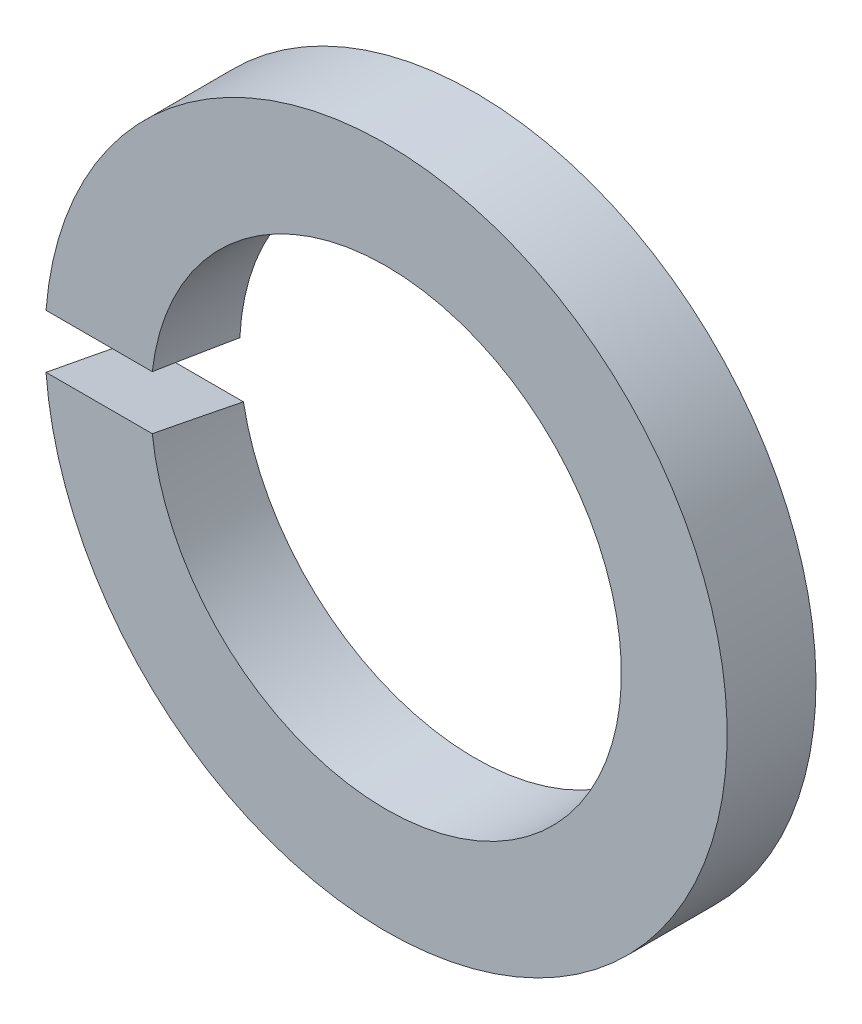
ISO-10303-21;
HEADER;
FILE_DESCRIPTION(('STEP AP214'),'2;1');
FILE_NAME('part.step','',(''),(''),'','','');
FILE_SCHEMA(('AUTOMOTIVE_DESIGN { 1 0 10303 214 1 1 1 1 }'));
ENDSEC;
DATA;
#1=APPLICATION_CONTEXT('core data for automotive mechanical design processes');
#2=APPLICATION_PROTOCOL_DEFINITION('international standard','automotive_design',2000,#1);
#3=PRODUCT_CONTEXT('',#1,'mechanical');
#4=PRODUCT('Part','Part','',(#3));
#5=PRODUCT_RELATED_PRODUCT_CATEGORY('part','',(#4));
#6=PRODUCT_DEFINITION_FORMATION('','',#4);
#7=PRODUCT_DEFINITION_CONTEXT('part definition',#1,'design');
#8=PRODUCT_DEFINITION('design','',#6,#7);
#9=PRODUCT_DEFINITION_SHAPE('','',#8);
#10=(LENGTH_UNIT() NAMED_UNIT(*) SI_UNIT(.MILLI.,.METRE.));
#11=(NAMED_UNIT(*) PLANE_ANGLE_UNIT() SI_UNIT($,.RADIAN.));
#12=(NAMED_UNIT(*) SI_UNIT($,.STERADIAN.) SOLID_ANGLE_UNIT());
#13=UNCERTAINTY_MEASURE_WITH_UNIT(LENGTH_MEASURE(1.E-05),#10,'distance_accuracy_value','');
#14=(GEOMETRIC_REPRESENTATION_CONTEXT(3) GLOBAL_UNCERTAINTY_ASSIGNED_CONTEXT((#13)) GLOBAL_UNIT_ASSIGNED_CONTEXT((#10,
#11,#12)) REPRESENTATION_CONTEXT('',''));
#15=CARTESIAN_POINT('',(0.,0.,0.));
#16=DIRECTION('',(0.,0.,1.));
#17=DIRECTION('',(1.,0.,0.));
#18=AXIS2_PLACEMENT_3D('',#15,#16,#17);
#19=CARTESIAN_POINT('',(11.,-1.35,12.));
#20=DIRECTION('',(0.,0.,-1.));
#21=DIRECTION('',(-1.,0.,0.));
#22=AXIS2_PLACEMENT_3D('',#19,#20,#21);
#23=CYLINDRICAL_SURFACE('',#22,1.1125);
#24=CARTESIAN_POINT('',(11.,-1.35,12.7198463103945));
#25=DIRECTION('',(0.,-0.984807753012213,0.173648177666903));
#26=DIRECTION('',(0.,-0.173648177666903,-0.984807753012213));
#27=AXIS2_PLACEMENT_3D('',#24,#25,#26);
#28=ELLIPSE('',#27,6.40663216249833,1.1125);
#29=CARTESIAN_POINT('',(9.894764527381,-1.476928326486,12.));
#30=VERTEX_POINT('',#29);
#31=CARTESIAN_POINT('',(9.905805769013,-1.550985658383,11.58));
#32=VERTEX_POINT('',#31);
#33=EDGE_CURVE('E58',#30,#32,#28,.T.);
#34=ORIENTED_EDGE('',*,*,#33,.F.);
#35=CARTESIAN_POINT('',(11.,-1.35,12.));
#36=DIRECTION('',(0.,0.,-1.));
#37=DIRECTION('',(1.,0.,0.));
#38=AXIS2_PLACEMENT_3D('',#35,#36,#37);
#39=CIRCLE('',#38,1.1125);
#40=CARTESIAN_POINT('',(9.894764527381,-1.223071673514,12.));
#41=VERTEX_POINT('',#40);
#42=EDGE_CURVE('E87',#41,#30,#39,.T.);
#43=ORIENTED_EDGE('',*,*,#42,.F.);
#44=CARTESIAN_POINT('',(11.,-1.35,11.2801536896054));
#45=DIRECTION('',(0.,0.984807753012213,-0.173648177666903));
#46=DIRECTION('',(0.,-0.173648177666903,-0.984807753012213));
#47=AXIS2_PLACEMENT_3D('',#44,#45,#46);
#48=ELLIPSE('',#47,6.40663216249833,1.1125);
#49=CARTESIAN_POINT('',(9.888757043698,-1.297129005412,11.58));
#50=VERTEX_POINT('',#49);
#51=EDGE_CURVE('E100',#50,#41,#48,.T.);
#52=ORIENTED_EDGE('',*,*,#51,.F.);
#53=CARTESIAN_POINT('',(11.,-1.35,11.58));
#54=DIRECTION('',(0.,0.,1.));
#55=DIRECTION('',(-0.983545376167682,-0.180661265962497,0.));
#56=AXIS2_PLACEMENT_3D('',#53,#54,#55);
#57=CIRCLE('',#56,1.1125);
#58=EDGE_CURVE('E11',#32,#50,#57,.T.);
#59=ORIENTED_EDGE('',*,*,#58,.F.);
#60=EDGE_LOOP('',(#34,#43,#52,#59));
#61=FACE_BOUND('',#60,.T.);
#62=ADVANCED_FACE('F16',(#61),#23,.F.);
#63=CARTESIAN_POINT('',(11.,-1.35,11.58));
#64=DIRECTION('',(0.,0.,-1.));
#65=DIRECTION('',(0.,-1.,0.));
#66=AXIS2_PLACEMENT_3D('',#63,#64,#65);
#67=PLANE('',#66);
#68=ORIENTED_EDGE('',*,*,#58,.T.);
#69=DIRECTION('',(-1.,0.,0.));
#70=VECTOR('',#69,1.);
#71=CARTESIAN_POINT('',(9.888757043698,-1.297129005412,11.58));
#72=LINE('',#71,#70);
#73=CARTESIAN_POINT('',(9.388367005819,-1.297129005412,11.58));
#74=VERTEX_POINT('',#73);
#75=EDGE_CURVE('E93',#50,#74,#72,.T.);
#76=ORIENTED_EDGE('',*,*,#75,.T.);
#77=CARTESIAN_POINT('',(11.,-1.35,11.58));
#78=DIRECTION('',(0.,0.,-1.));
#79=DIRECTION('',(-0.999462321972413,0.0327882136980905,0.));
#80=AXIS2_PLACEMENT_3D('',#77,#78,#79);
#81=CIRCLE('',#80,1.6125);
#82=CARTESIAN_POINT('',(9.400074684517,-1.550985658383,11.58));
#83=VERTEX_POINT('',#82);
#84=EDGE_CURVE('E80',#74,#83,#81,.T.);
#85=ORIENTED_EDGE('',*,*,#84,.T.);
#86=DIRECTION('',(1.,0.,0.));
#87=VECTOR('',#86,1.);
#88=CARTESIAN_POINT('',(9.400074684517,-1.550985658383,11.58));
#89=LINE('',#88,#87);
#90=EDGE_CURVE('E24',#83,#32,#89,.T.);
#91=ORIENTED_EDGE('',*,*,#90,.T.);
#92=EDGE_LOOP('',(#68,#76,#85,#91));
#93=FACE_BOUND('',#92,.T.);
#94=ADVANCED_FACE('F98',(#93),#67,.T.);
#95=CARTESIAN_POINT('',(9.8875,-1.277746769251,13.12961474435));
#96=DIRECTION('',(0.,-0.984807753012213,0.173648177666903));
#97=DIRECTION('',(-1.,0.,0.));
#98=AXIS2_PLACEMENT_3D('',#95,#96,#97);
#99=PLANE('',#98);
#100=DIRECTION('',(-1.,0.,0.));
#101=VECTOR('',#100,1.);
#102=CARTESIAN_POINT('',(9.894764527381,-1.476928326486,12.));
#103=LINE('',#102,#101);
#104=CARTESIAN_POINT('',(9.392503359277,-1.476928326486,12.));
#105=VERTEX_POINT('',#104);
#106=EDGE_CURVE('E96',#30,#105,#103,.T.);
#107=ORIENTED_EDGE('',*,*,#106,.F.);
#108=ORIENTED_EDGE('',*,*,#33,.T.);
#109=ORIENTED_EDGE('',*,*,#90,.F.);
#110=CARTESIAN_POINT('',(11.,-1.35,12.7198463103945));
#111=DIRECTION('',(0.,-0.984807753012213,0.173648177666903));
#112=DIRECTION('',(0.,-0.173648177666903,-0.984807753012213));
#113=AXIS2_PLACEMENT_3D('',#110,#111,#112);
#114=ELLIPSE('',#113,9.28601740407061,1.6125);
#115=EDGE_CURVE('E85',#105,#83,#114,.T.);
#116=ORIENTED_EDGE('',*,*,#115,.F.);
#117=EDGE_LOOP('',(#107,#108,#109,#116));
#118=FACE_BOUND('',#117,.T.);
#119=ADVANCED_FACE('F182',(#118),#99,.F.);
#120=CARTESIAN_POINT('',(11.,-1.35,12.));
#121=DIRECTION('',(0.,0.,-1.));
#122=DIRECTION('',(-1.,0.,0.));
#123=AXIS2_PLACEMENT_3D('',#120,#121,#122);
#124=CYLINDRICAL_SURFACE('',#123,1.6125);
#125=ORIENTED_EDGE('',*,*,#84,.F.);
#126=CARTESIAN_POINT('',(11.,-1.35,11.2801536896054));
#127=DIRECTION('',(0.,0.984807753012213,-0.173648177666903));
#128=DIRECTION('',(0.,-0.173648177666903,-0.984807753012213));
#129=AXIS2_PLACEMENT_3D('',#126,#127,#128);
#130=ELLIPSE('',#129,9.28601740407061,1.6125);
#131=CARTESIAN_POINT('',(9.392503359277,-1.223071673514,12.));
#132=VERTEX_POINT('',#131);
#133=EDGE_CURVE('E83',#74,#132,#130,.T.);
#134=ORIENTED_EDGE('',*,*,#133,.T.);
#135=CARTESIAN_POINT('',(11.,-1.35,12.));
#136=DIRECTION('',(0.,0.,1.));
#137=DIRECTION('',(1.,0.,0.));
#138=AXIS2_PLACEMENT_3D('',#135,#136,#137);
#139=CIRCLE('',#138,1.6125);
#140=EDGE_CURVE('E68',#105,#132,#139,.T.);
#141=ORIENTED_EDGE('',*,*,#140,.F.);
#142=ORIENTED_EDGE('',*,*,#115,.T.);
#143=EDGE_LOOP('',(#125,#134,#141,#142));
#144=FACE_BOUND('',#143,.T.);
#145=ADVANCED_FACE('F82',(#144),#124,.T.);
#146=CARTESIAN_POINT('',(11.,-1.35,12.));
#147=DIRECTION('',(0.,0.,1.));
#148=DIRECTION('',(1.,0.,0.));
#149=AXIS2_PLACEMENT_3D('',#146,#147,#148);
#150=PLANE('',#149);
#151=ORIENTED_EDGE('',*,*,#106,.T.);
#152=ORIENTED_EDGE('',*,*,#140,.T.);
#153=DIRECTION('',(1.,0.,0.));
#154=VECTOR('',#153,1.);
#155=CARTESIAN_POINT('',(9.392503359277,-1.223071673514,12.));
#156=LINE('',#155,#154);
#157=EDGE_CURVE('E94',#132,#41,#156,.T.);
#158=ORIENTED_EDGE('',*,*,#157,.T.);
#159=ORIENTED_EDGE('',*,*,#42,.T.);
#160=EDGE_LOOP('',(#151,#152,#158,#159));
#161=FACE_BOUND('',#160,.T.);
#162=ADVANCED_FACE('F162',(#161),#150,.T.);
#163=CARTESIAN_POINT('',(9.8875,-1.031544830998,13.08620269993));
#164=DIRECTION('',(0.,0.984807753012213,-0.173648177666903));
#165=DIRECTION('',(-1.,0.,0.));
#166=AXIS2_PLACEMENT_3D('',#163,#164,#165);
#167=PLANE('',#166);
#168=ORIENTED_EDGE('',*,*,#75,.F.);
#169=ORIENTED_EDGE('',*,*,#51,.T.);
#170=ORIENTED_EDGE('',*,*,#157,.F.);
#171=ORIENTED_EDGE('',*,*,#133,.F.);
#172=EDGE_LOOP('',(#168,#169,#170,#171));
#173=FACE_BOUND('',#172,.T.);
#174=ADVANCED_FACE('F91',(#173),#167,.F.);
#175=CLOSED_SHELL('',(#62,#94,#119,#145,#162,#174));
#176=MANIFOLD_SOLID_BREP('B1',#175);
#177=ADVANCED_BREP_SHAPE_REPRESENTATION('',(#18,#176),#14);
#178=SHAPE_DEFINITION_REPRESENTATION(#9,#177);
ENDSEC;
END-ISO-10303-21;
